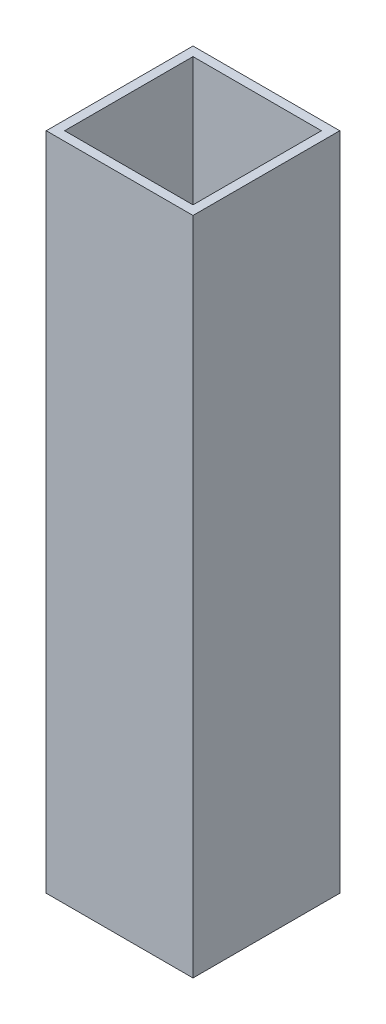
ISO-10303-21;
HEADER;
FILE_DESCRIPTION(('STEP AP214'),'2;1');
FILE_NAME('part.step','',(''),(''),'','','');
FILE_SCHEMA(('AUTOMOTIVE_DESIGN { 1 0 10303 214 1 1 1 1 }'));
ENDSEC;
DATA;
#1=APPLICATION_CONTEXT('core data for automotive mechanical design processes');
#2=APPLICATION_PROTOCOL_DEFINITION('international standard','automotive_design',2000,#1);
#3=PRODUCT_CONTEXT('',#1,'mechanical');
#4=PRODUCT('Part','Part','',(#3));
#5=PRODUCT_RELATED_PRODUCT_CATEGORY('part','',(#4));
#6=PRODUCT_DEFINITION_FORMATION('','',#4);
#7=PRODUCT_DEFINITION_CONTEXT('part definition',#1,'design');
#8=PRODUCT_DEFINITION('design','',#6,#7);
#9=PRODUCT_DEFINITION_SHAPE('','',#8);
#10=(LENGTH_UNIT() NAMED_UNIT(*) SI_UNIT(.MILLI.,.METRE.));
#11=(NAMED_UNIT(*) PLANE_ANGLE_UNIT() SI_UNIT($,.RADIAN.));
#12=(NAMED_UNIT(*) SI_UNIT($,.STERADIAN.) SOLID_ANGLE_UNIT());
#13=UNCERTAINTY_MEASURE_WITH_UNIT(LENGTH_MEASURE(1.E-05),#10,'distance_accuracy_value','');
#14=(GEOMETRIC_REPRESENTATION_CONTEXT(3) GLOBAL_UNCERTAINTY_ASSIGNED_CONTEXT((#13)) GLOBAL_UNIT_ASSIGNED_CONTEXT((#10,
#11,#12)) REPRESENTATION_CONTEXT('',''));
#15=CARTESIAN_POINT('',(0.,0.,0.));
#16=DIRECTION('',(0.,0.,1.));
#17=DIRECTION('',(1.,0.,0.));
#18=AXIS2_PLACEMENT_3D('',#15,#16,#17);
#19=CARTESIAN_POINT('',(0.,114.3,0.));
#20=DIRECTION('',(0.,1.,0.));
#21=DIRECTION('',(0.,0.,1.));
#22=AXIS2_PLACEMENT_3D('',#19,#20,#21);
#23=PLANE('',#22);
#24=DIRECTION('',(0.,0.,1.));
#25=VECTOR('',#24,1.);
#26=CARTESIAN_POINT('',(-12.7,114.3,12.7));
#27=LINE('',#26,#25);
#28=CARTESIAN_POINT('',(-12.7,114.3,-12.7));
#29=VERTEX_POINT('',#28);
#30=CARTESIAN_POINT('',(-12.7,114.3,12.7));
#31=VERTEX_POINT('',#30);
#32=EDGE_CURVE('E136',#29,#31,#27,.T.);
#33=ORIENTED_EDGE('',*,*,#32,.T.);
#34=DIRECTION('',(1.,0.,0.));
#35=VECTOR('',#34,1.);
#36=CARTESIAN_POINT('',(12.7,114.3,12.7));
#37=LINE('',#36,#35);
#38=CARTESIAN_POINT('',(12.7,114.3,12.7));
#39=VERTEX_POINT('',#38);
#40=EDGE_CURVE('E139',#31,#39,#37,.T.);
#41=ORIENTED_EDGE('',*,*,#40,.T.);
#42=DIRECTION('',(0.,0.,-1.));
#43=VECTOR('',#42,1.);
#44=CARTESIAN_POINT('',(12.7,114.3,12.7));
#45=LINE('',#44,#43);
#46=CARTESIAN_POINT('',(12.7,114.3,-12.7));
#47=VERTEX_POINT('',#46);
#48=EDGE_CURVE('E142',#39,#47,#45,.T.);
#49=ORIENTED_EDGE('',*,*,#48,.T.);
#50=DIRECTION('',(-1.,0.,0.));
#51=VECTOR('',#50,1.);
#52=CARTESIAN_POINT('',(12.7,114.3,-12.7));
#53=LINE('',#52,#51);
#54=EDGE_CURVE('E144',#47,#29,#53,.T.);
#55=ORIENTED_EDGE('',*,*,#54,.T.);
#56=EDGE_LOOP('',(#33,#41,#49,#55));
#57=FACE_BOUND('',#56,.T.);
#58=DIRECTION('',(1.,0.,0.));
#59=VECTOR('',#58,1.);
#60=CARTESIAN_POINT('',(11.1125,114.3,11.1125));
#61=LINE('',#60,#59);
#62=CARTESIAN_POINT('',(-11.1125,114.3,11.1125));
#63=VERTEX_POINT('',#62);
#64=CARTESIAN_POINT('',(11.1125,114.3,11.1125));
#65=VERTEX_POINT('',#64);
#66=EDGE_CURVE('E108',#63,#65,#61,.T.);
#67=ORIENTED_EDGE('',*,*,#66,.F.);
#68=DIRECTION('',(0.,0.,1.));
#69=VECTOR('',#68,1.);
#70=CARTESIAN_POINT('',(-11.1125,114.3,11.1125));
#71=LINE('',#70,#69);
#72=CARTESIAN_POINT('',(-11.1125,114.3,-11.1125));
#73=VERTEX_POINT('',#72);
#74=EDGE_CURVE('E100',#73,#63,#71,.T.);
#75=ORIENTED_EDGE('',*,*,#74,.F.);
#76=DIRECTION('',(-1.,0.,0.));
#77=VECTOR('',#76,1.);
#78=CARTESIAN_POINT('',(11.1125,114.3,-11.1125));
#79=LINE('',#78,#77);
#80=CARTESIAN_POINT('',(11.1125,114.3,-11.1125));
#81=VERTEX_POINT('',#80);
#82=EDGE_CURVE('E122',#81,#73,#79,.T.);
#83=ORIENTED_EDGE('',*,*,#82,.F.);
#84=DIRECTION('',(0.,0.,-1.));
#85=VECTOR('',#84,1.);
#86=CARTESIAN_POINT('',(11.1125,114.3,11.1125));
#87=LINE('',#86,#85);
#88=EDGE_CURVE('E120',#65,#81,#87,.T.);
#89=ORIENTED_EDGE('',*,*,#88,.F.);
#90=EDGE_LOOP('',(#67,#75,#83,#89));
#91=FACE_BOUND('',#90,.T.);
#92=ADVANCED_FACE('F35',(#57,#91),#23,.T.);
#93=CARTESIAN_POINT('',(0.,0.,0.));
#94=DIRECTION('',(0.,1.,0.));
#95=DIRECTION('',(0.,0.,1.));
#96=AXIS2_PLACEMENT_3D('',#93,#94,#95);
#97=PLANE('',#96);
#98=DIRECTION('',(0.,0.,1.));
#99=VECTOR('',#98,1.);
#100=CARTESIAN_POINT('',(-12.7,0.,12.7));
#101=LINE('',#100,#99);
#102=CARTESIAN_POINT('',(-12.7,0.,-12.7));
#103=VERTEX_POINT('',#102);
#104=CARTESIAN_POINT('',(-12.7,0.,12.7));
#105=VERTEX_POINT('',#104);
#106=EDGE_CURVE('E116',#103,#105,#101,.T.);
#107=ORIENTED_EDGE('',*,*,#106,.F.);
#108=DIRECTION('',(-1.,0.,0.));
#109=VECTOR('',#108,1.);
#110=CARTESIAN_POINT('',(12.7,0.,-12.7));
#111=LINE('',#110,#109);
#112=CARTESIAN_POINT('',(12.7,0.,-12.7));
#113=VERTEX_POINT('',#112);
#114=EDGE_CURVE('E140',#113,#103,#111,.T.);
#115=ORIENTED_EDGE('',*,*,#114,.F.);
#116=DIRECTION('',(0.,0.,-1.));
#117=VECTOR('',#116,1.);
#118=CARTESIAN_POINT('',(12.7,0.,12.7));
#119=LINE('',#118,#117);
#120=CARTESIAN_POINT('',(12.7,0.,12.7));
#121=VERTEX_POINT('',#120);
#122=EDGE_CURVE('E151',#121,#113,#119,.T.);
#123=ORIENTED_EDGE('',*,*,#122,.F.);
#124=DIRECTION('',(1.,0.,0.));
#125=VECTOR('',#124,1.);
#126=CARTESIAN_POINT('',(12.7,0.,12.7));
#127=LINE('',#126,#125);
#128=EDGE_CURVE('E149',#105,#121,#127,.T.);
#129=ORIENTED_EDGE('',*,*,#128,.F.);
#130=EDGE_LOOP('',(#107,#115,#123,#129));
#131=FACE_BOUND('',#130,.T.);
#132=DIRECTION('',(0.,0.,1.));
#133=VECTOR('',#132,1.);
#134=CARTESIAN_POINT('',(-11.1125,0.,11.1125));
#135=LINE('',#134,#133);
#136=CARTESIAN_POINT('',(-11.1125,0.,-11.1125));
#137=VERTEX_POINT('',#136);
#138=CARTESIAN_POINT('',(-11.1125,0.,11.1125));
#139=VERTEX_POINT('',#138);
#140=EDGE_CURVE('E58',#137,#139,#135,.T.);
#141=ORIENTED_EDGE('',*,*,#140,.T.);
#142=DIRECTION('',(1.,0.,0.));
#143=VECTOR('',#142,1.);
#144=CARTESIAN_POINT('',(11.1125,0.,11.1125));
#145=LINE('',#144,#143);
#146=CARTESIAN_POINT('',(11.1125,0.,11.1125));
#147=VERTEX_POINT('',#146);
#148=EDGE_CURVE('E115',#139,#147,#145,.T.);
#149=ORIENTED_EDGE('',*,*,#148,.T.);
#150=DIRECTION('',(0.,0.,-1.));
#151=VECTOR('',#150,1.);
#152=CARTESIAN_POINT('',(11.1125,0.,11.1125));
#153=LINE('',#152,#151);
#154=CARTESIAN_POINT('',(11.1125,0.,-11.1125));
#155=VERTEX_POINT('',#154);
#156=EDGE_CURVE('E128',#147,#155,#153,.T.);
#157=ORIENTED_EDGE('',*,*,#156,.T.);
#158=DIRECTION('',(-1.,0.,0.));
#159=VECTOR('',#158,1.);
#160=CARTESIAN_POINT('',(11.1125,0.,-11.1125));
#161=LINE('',#160,#159);
#162=EDGE_CURVE('E109',#155,#137,#161,.T.);
#163=ORIENTED_EDGE('',*,*,#162,.T.);
#164=EDGE_LOOP('',(#141,#149,#157,#163));
#165=FACE_BOUND('',#164,.T.);
#166=ADVANCED_FACE('F169',(#131,#165),#97,.F.);
#167=CARTESIAN_POINT('',(-12.7,114.3,12.7));
#168=DIRECTION('',(1.,0.,0.));
#169=DIRECTION('',(0.,0.,-1.));
#170=AXIS2_PLACEMENT_3D('',#167,#168,#169);
#171=PLANE('',#170);
#172=ORIENTED_EDGE('',*,*,#106,.T.);
#173=DIRECTION('',(0.,-1.,0.));
#174=VECTOR('',#173,1.);
#175=CARTESIAN_POINT('',(-12.7,114.3,12.7));
#176=LINE('',#175,#174);
#177=EDGE_CURVE('E11',#31,#105,#176,.T.);
#178=ORIENTED_EDGE('',*,*,#177,.F.);
#179=ORIENTED_EDGE('',*,*,#32,.F.);
#180=DIRECTION('',(0.,-1.,0.));
#181=VECTOR('',#180,1.);
#182=CARTESIAN_POINT('',(-12.7,114.3,-12.7));
#183=LINE('',#182,#181);
#184=EDGE_CURVE('E146',#29,#103,#183,.T.);
#185=ORIENTED_EDGE('',*,*,#184,.T.);
#186=EDGE_LOOP('',(#172,#178,#179,#185));
#187=FACE_BOUND('',#186,.T.);
#188=ADVANCED_FACE('F37',(#187),#171,.F.);
#189=CARTESIAN_POINT('',(12.7,114.3,12.7));
#190=DIRECTION('',(0.,0.,-1.));
#191=DIRECTION('',(-1.,0.,0.));
#192=AXIS2_PLACEMENT_3D('',#189,#190,#191);
#193=PLANE('',#192);
#194=ORIENTED_EDGE('',*,*,#128,.T.);
#195=DIRECTION('',(0.,-1.,0.));
#196=VECTOR('',#195,1.);
#197=CARTESIAN_POINT('',(12.7,114.3,12.7));
#198=LINE('',#197,#196);
#199=EDGE_CURVE('E43',#39,#121,#198,.T.);
#200=ORIENTED_EDGE('',*,*,#199,.F.);
#201=ORIENTED_EDGE('',*,*,#40,.F.);
#202=ORIENTED_EDGE('',*,*,#177,.T.);
#203=EDGE_LOOP('',(#194,#200,#201,#202));
#204=FACE_BOUND('',#203,.T.);
#205=ADVANCED_FACE('F179',(#204),#193,.F.);
#206=CARTESIAN_POINT('',(12.7,114.3,12.7));
#207=DIRECTION('',(-1.,0.,0.));
#208=DIRECTION('',(0.,0.,1.));
#209=AXIS2_PLACEMENT_3D('',#206,#207,#208);
#210=PLANE('',#209);
#211=ORIENTED_EDGE('',*,*,#122,.T.);
#212=DIRECTION('',(0.,-1.,0.));
#213=VECTOR('',#212,1.);
#214=CARTESIAN_POINT('',(12.7,114.3,-12.7));
#215=LINE('',#214,#213);
#216=EDGE_CURVE('E156',#47,#113,#215,.T.);
#217=ORIENTED_EDGE('',*,*,#216,.F.);
#218=ORIENTED_EDGE('',*,*,#48,.F.);
#219=ORIENTED_EDGE('',*,*,#199,.T.);
#220=EDGE_LOOP('',(#211,#217,#218,#219));
#221=FACE_BOUND('',#220,.T.);
#222=ADVANCED_FACE('F163',(#221),#210,.F.);
#223=CARTESIAN_POINT('',(12.7,114.3,-12.7));
#224=DIRECTION('',(0.,0.,1.));
#225=DIRECTION('',(1.,0.,0.));
#226=AXIS2_PLACEMENT_3D('',#223,#224,#225);
#227=PLANE('',#226);
#228=ORIENTED_EDGE('',*,*,#114,.T.);
#229=ORIENTED_EDGE('',*,*,#184,.F.);
#230=ORIENTED_EDGE('',*,*,#54,.F.);
#231=ORIENTED_EDGE('',*,*,#216,.T.);
#232=EDGE_LOOP('',(#228,#229,#230,#231));
#233=FACE_BOUND('',#232,.T.);
#234=ADVANCED_FACE('F173',(#233),#227,.F.);
#235=CARTESIAN_POINT('',(-11.1125,114.3,11.1125));
#236=DIRECTION('',(1.,0.,0.));
#237=DIRECTION('',(0.,0.,-1.));
#238=AXIS2_PLACEMENT_3D('',#235,#236,#237);
#239=PLANE('',#238);
#240=ORIENTED_EDGE('',*,*,#140,.F.);
#241=DIRECTION('',(0.,-1.,0.));
#242=VECTOR('',#241,1.);
#243=CARTESIAN_POINT('',(-11.1125,114.3,-11.1125));
#244=LINE('',#243,#242);
#245=EDGE_CURVE('E104',#73,#137,#244,.T.);
#246=ORIENTED_EDGE('',*,*,#245,.F.);
#247=ORIENTED_EDGE('',*,*,#74,.T.);
#248=DIRECTION('',(0.,-1.,0.));
#249=VECTOR('',#248,1.);
#250=CARTESIAN_POINT('',(-11.1125,114.3,11.1125));
#251=LINE('',#250,#249);
#252=EDGE_CURVE('E103',#63,#139,#251,.T.);
#253=ORIENTED_EDGE('',*,*,#252,.T.);
#254=EDGE_LOOP('',(#240,#246,#247,#253));
#255=FACE_BOUND('',#254,.T.);
#256=ADVANCED_FACE('F102',(#255),#239,.T.);
#257=CARTESIAN_POINT('',(11.1125,114.3,11.1125));
#258=DIRECTION('',(0.,0.,-1.));
#259=DIRECTION('',(-1.,0.,0.));
#260=AXIS2_PLACEMENT_3D('',#257,#258,#259);
#261=PLANE('',#260);
#262=ORIENTED_EDGE('',*,*,#148,.F.);
#263=ORIENTED_EDGE('',*,*,#252,.F.);
#264=ORIENTED_EDGE('',*,*,#66,.T.);
#265=DIRECTION('',(0.,-1.,0.));
#266=VECTOR('',#265,1.);
#267=CARTESIAN_POINT('',(11.1125,114.3,11.1125));
#268=LINE('',#267,#266);
#269=EDGE_CURVE('E117',#65,#147,#268,.T.);
#270=ORIENTED_EDGE('',*,*,#269,.T.);
#271=EDGE_LOOP('',(#262,#263,#264,#270));
#272=FACE_BOUND('',#271,.T.);
#273=ADVANCED_FACE('F112',(#272),#261,.T.);
#274=CARTESIAN_POINT('',(11.1125,114.3,11.1125));
#275=DIRECTION('',(-1.,0.,0.));
#276=DIRECTION('',(0.,0.,1.));
#277=AXIS2_PLACEMENT_3D('',#274,#275,#276);
#278=PLANE('',#277);
#279=ORIENTED_EDGE('',*,*,#156,.F.);
#280=ORIENTED_EDGE('',*,*,#269,.F.);
#281=ORIENTED_EDGE('',*,*,#88,.T.);
#282=DIRECTION('',(0.,-1.,0.));
#283=VECTOR('',#282,1.);
#284=CARTESIAN_POINT('',(11.1125,114.3,-11.1125));
#285=LINE('',#284,#283);
#286=EDGE_CURVE('E50',#81,#155,#285,.T.);
#287=ORIENTED_EDGE('',*,*,#286,.T.);
#288=EDGE_LOOP('',(#279,#280,#281,#287));
#289=FACE_BOUND('',#288,.T.);
#290=ADVANCED_FACE('F202',(#289),#278,.T.);
#291=CARTESIAN_POINT('',(11.1125,114.3,-11.1125));
#292=DIRECTION('',(0.,0.,1.));
#293=DIRECTION('',(1.,0.,0.));
#294=AXIS2_PLACEMENT_3D('',#291,#292,#293);
#295=PLANE('',#294);
#296=ORIENTED_EDGE('',*,*,#162,.F.);
#297=ORIENTED_EDGE('',*,*,#286,.F.);
#298=ORIENTED_EDGE('',*,*,#82,.T.);
#299=ORIENTED_EDGE('',*,*,#245,.T.);
#300=EDGE_LOOP('',(#296,#297,#298,#299));
#301=FACE_BOUND('',#300,.T.);
#302=ADVANCED_FACE('F206',(#301),#295,.T.);
#303=CLOSED_SHELL('',(#92,#166,#188,#205,#222,#234,#256,#273,#290,#302));
#304=MANIFOLD_SOLID_BREP('B2',#303);
#305=ADVANCED_BREP_SHAPE_REPRESENTATION('',(#18,#304),#14);
#306=SHAPE_DEFINITION_REPRESENTATION(#9,#305);
ENDSEC;
END-ISO-10303-21;
